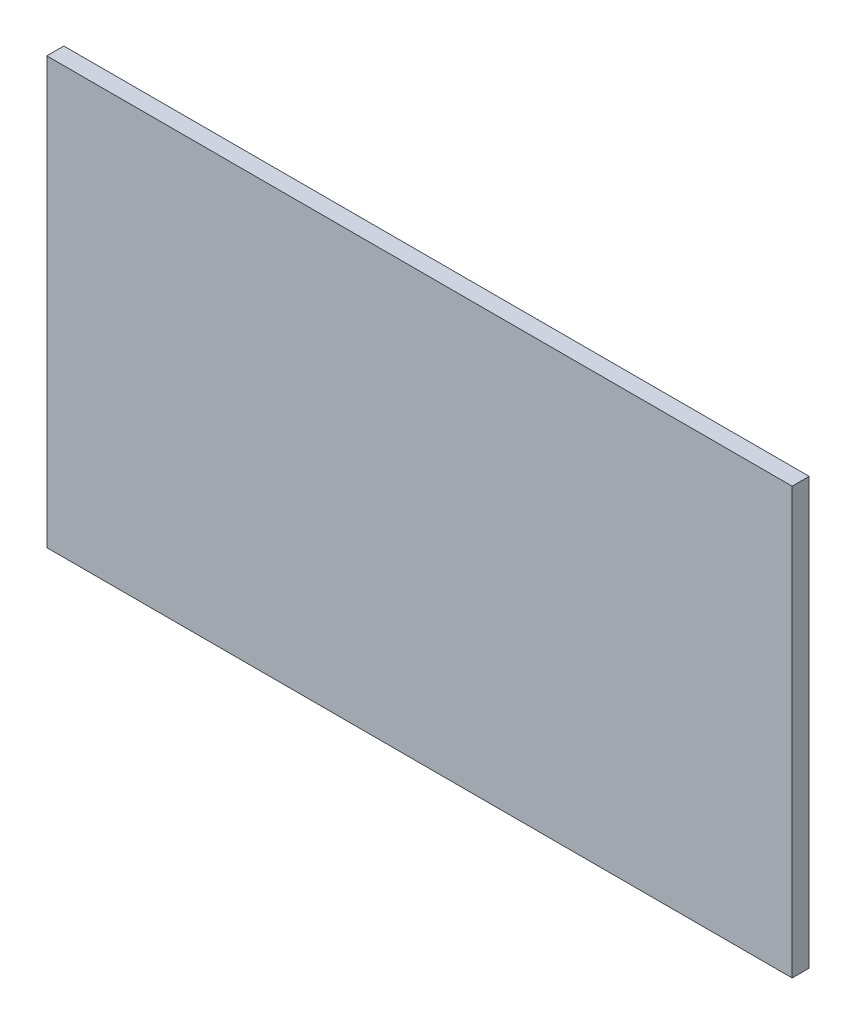
ISO-10303-21;
HEADER;
FILE_DESCRIPTION(('STEP AP214'),'2;1');
FILE_NAME('part.step','',(''),(''),'','','');
FILE_SCHEMA(('AUTOMOTIVE_DESIGN { 1 0 10303 214 1 1 1 1 }'));
ENDSEC;
DATA;
#1=APPLICATION_CONTEXT('core data for automotive mechanical design processes');
#2=APPLICATION_PROTOCOL_DEFINITION('international standard','automotive_design',2000,#1);
#3=PRODUCT_CONTEXT('',#1,'mechanical');
#4=PRODUCT('Part','Part','',(#3));
#5=PRODUCT_RELATED_PRODUCT_CATEGORY('part','',(#4));
#6=PRODUCT_DEFINITION_FORMATION('','',#4);
#7=PRODUCT_DEFINITION_CONTEXT('part definition',#1,'design');
#8=PRODUCT_DEFINITION('design','',#6,#7);
#9=PRODUCT_DEFINITION_SHAPE('','',#8);
#10=(LENGTH_UNIT() NAMED_UNIT(*) SI_UNIT(.MILLI.,.METRE.));
#11=(NAMED_UNIT(*) PLANE_ANGLE_UNIT() SI_UNIT($,.RADIAN.));
#12=(NAMED_UNIT(*) SI_UNIT($,.STERADIAN.) SOLID_ANGLE_UNIT());
#13=UNCERTAINTY_MEASURE_WITH_UNIT(LENGTH_MEASURE(1.E-05),#10,'distance_accuracy_value','');
#14=(GEOMETRIC_REPRESENTATION_CONTEXT(3) GLOBAL_UNCERTAINTY_ASSIGNED_CONTEXT((#13)) GLOBAL_UNIT_ASSIGNED_CONTEXT((#10,
#11,#12)) REPRESENTATION_CONTEXT('',''));
#15=CARTESIAN_POINT('',(0.,0.,0.));
#16=DIRECTION('',(0.,0.,1.));
#17=DIRECTION('',(1.,0.,0.));
#18=AXIS2_PLACEMENT_3D('',#15,#16,#17);
#19=CARTESIAN_POINT('',(-35.,38.,1.6));
#20=DIRECTION('',(1.,0.,0.));
#21=DIRECTION('',(0.,0.,-1.));
#22=AXIS2_PLACEMENT_3D('',#19,#20,#21);
#23=PLANE('',#22);
#24=DIRECTION('',(0.,-1.,0.));
#25=VECTOR('',#24,1.);
#26=CARTESIAN_POINT('',(-35.,38.,0.));
#27=LINE('',#26,#25);
#28=CARTESIAN_POINT('',(-35.,78.,0.));
#29=VERTEX_POINT('',#28);
#30=CARTESIAN_POINT('',(-35.,38.,0.));
#31=VERTEX_POINT('',#30);
#32=EDGE_CURVE('E104',#29,#31,#27,.T.);
#33=ORIENTED_EDGE('',*,*,#32,.T.);
#34=DIRECTION('',(0.,0.,-1.));
#35=VECTOR('',#34,1.);
#36=CARTESIAN_POINT('',(-35.,38.,1.6));
#37=LINE('',#36,#35);
#38=CARTESIAN_POINT('',(-35.,38.,1.6));
#39=VERTEX_POINT('',#38);
#40=EDGE_CURVE('E11',#39,#31,#37,.T.);
#41=ORIENTED_EDGE('',*,*,#40,.F.);
#42=DIRECTION('',(0.,-1.,0.));
#43=VECTOR('',#42,1.);
#44=CARTESIAN_POINT('',(-35.,38.,1.6));
#45=LINE('',#44,#43);
#46=CARTESIAN_POINT('',(-35.,78.,1.6));
#47=VERTEX_POINT('',#46);
#48=EDGE_CURVE('E95',#47,#39,#45,.T.);
#49=ORIENTED_EDGE('',*,*,#48,.F.);
#50=DIRECTION('',(0.,0.,-1.));
#51=VECTOR('',#50,1.);
#52=CARTESIAN_POINT('',(-35.,78.,1.6));
#53=LINE('',#52,#51);
#54=EDGE_CURVE('E99',#47,#29,#53,.T.);
#55=ORIENTED_EDGE('',*,*,#54,.T.);
#56=EDGE_LOOP('',(#33,#41,#49,#55));
#57=FACE_BOUND('',#56,.T.);
#58=ADVANCED_FACE('F41',(#57),#23,.F.);
#59=CARTESIAN_POINT('',(-35.,38.,1.6));
#60=DIRECTION('',(0.,1.,0.));
#61=DIRECTION('',(0.,0.,1.));
#62=AXIS2_PLACEMENT_3D('',#59,#60,#61);
#63=PLANE('',#62);
#64=DIRECTION('',(1.,0.,0.));
#65=VECTOR('',#64,1.);
#66=CARTESIAN_POINT('',(-35.,38.,0.));
#67=LINE('',#66,#65);
#68=CARTESIAN_POINT('',(35.,38.,0.));
#69=VERTEX_POINT('',#68);
#70=EDGE_CURVE('E98',#31,#69,#67,.T.);
#71=ORIENTED_EDGE('',*,*,#70,.T.);
#72=DIRECTION('',(0.,0.,-1.));
#73=VECTOR('',#72,1.);
#74=CARTESIAN_POINT('',(35.,38.,1.6));
#75=LINE('',#74,#73);
#76=CARTESIAN_POINT('',(35.,38.,1.6));
#77=VERTEX_POINT('',#76);
#78=EDGE_CURVE('E47',#77,#69,#75,.T.);
#79=ORIENTED_EDGE('',*,*,#78,.F.);
#80=DIRECTION('',(1.,0.,0.));
#81=VECTOR('',#80,1.);
#82=CARTESIAN_POINT('',(-35.,38.,1.6));
#83=LINE('',#82,#81);
#84=EDGE_CURVE('E90',#39,#77,#83,.T.);
#85=ORIENTED_EDGE('',*,*,#84,.F.);
#86=ORIENTED_EDGE('',*,*,#40,.T.);
#87=EDGE_LOOP('',(#71,#79,#85,#86));
#88=FACE_BOUND('',#87,.T.);
#89=ADVANCED_FACE('F93',(#88),#63,.F.);
#90=CARTESIAN_POINT('',(35.,38.,1.6));
#91=DIRECTION('',(-1.,0.,0.));
#92=DIRECTION('',(0.,0.,1.));
#93=AXIS2_PLACEMENT_3D('',#90,#91,#92);
#94=PLANE('',#93);
#95=DIRECTION('',(0.,1.,0.));
#96=VECTOR('',#95,1.);
#97=CARTESIAN_POINT('',(35.,38.,0.));
#98=LINE('',#97,#96);
#99=CARTESIAN_POINT('',(35.,78.,0.));
#100=VERTEX_POINT('',#99);
#101=EDGE_CURVE('E71',#69,#100,#98,.T.);
#102=ORIENTED_EDGE('',*,*,#101,.T.);
#103=DIRECTION('',(0.,0.,-1.));
#104=VECTOR('',#103,1.);
#105=CARTESIAN_POINT('',(35.,78.,1.6));
#106=LINE('',#105,#104);
#107=CARTESIAN_POINT('',(35.,78.,1.6));
#108=VERTEX_POINT('',#107);
#109=EDGE_CURVE('E97',#108,#100,#106,.T.);
#110=ORIENTED_EDGE('',*,*,#109,.F.);
#111=DIRECTION('',(0.,1.,0.));
#112=VECTOR('',#111,1.);
#113=CARTESIAN_POINT('',(35.,38.,1.6));
#114=LINE('',#113,#112);
#115=EDGE_CURVE('E89',#77,#108,#114,.T.);
#116=ORIENTED_EDGE('',*,*,#115,.F.);
#117=ORIENTED_EDGE('',*,*,#78,.T.);
#118=EDGE_LOOP('',(#102,#110,#116,#117));
#119=FACE_BOUND('',#118,.T.);
#120=ADVANCED_FACE('F96',(#119),#94,.F.);
#121=CARTESIAN_POINT('',(-35.,78.,1.6));
#122=DIRECTION('',(0.,-1.,0.));
#123=DIRECTION('',(0.,0.,-1.));
#124=AXIS2_PLACEMENT_3D('',#121,#122,#123);
#125=PLANE('',#124);
#126=DIRECTION('',(-1.,0.,0.));
#127=VECTOR('',#126,1.);
#128=CARTESIAN_POINT('',(-35.,78.,0.));
#129=LINE('',#128,#127);
#130=EDGE_CURVE('E78',#100,#29,#129,.T.);
#131=ORIENTED_EDGE('',*,*,#130,.T.);
#132=ORIENTED_EDGE('',*,*,#54,.F.);
#133=DIRECTION('',(-1.,0.,0.));
#134=VECTOR('',#133,1.);
#135=CARTESIAN_POINT('',(-35.,78.,1.6));
#136=LINE('',#135,#134);
#137=EDGE_CURVE('E60',#108,#47,#136,.T.);
#138=ORIENTED_EDGE('',*,*,#137,.F.);
#139=ORIENTED_EDGE('',*,*,#109,.T.);
#140=EDGE_LOOP('',(#131,#132,#138,#139));
#141=FACE_BOUND('',#140,.T.);
#142=ADVANCED_FACE('F111',(#141),#125,.F.);
#143=CARTESIAN_POINT('',(0.,0.,1.6));
#144=DIRECTION('',(0.,0.,-1.));
#145=DIRECTION('',(-1.,0.,0.));
#146=AXIS2_PLACEMENT_3D('',#143,#144,#145);
#147=PLANE('',#146);
#148=ORIENTED_EDGE('',*,*,#48,.T.);
#149=ORIENTED_EDGE('',*,*,#84,.T.);
#150=ORIENTED_EDGE('',*,*,#115,.T.);
#151=ORIENTED_EDGE('',*,*,#137,.T.);
#152=EDGE_LOOP('',(#148,#149,#150,#151));
#153=FACE_BOUND('',#152,.T.);
#154=ADVANCED_FACE('F86',(#153),#147,.F.);
#155=CARTESIAN_POINT('',(0.,0.,0.));
#156=DIRECTION('',(0.,0.,-1.));
#157=DIRECTION('',(-1.,0.,0.));
#158=AXIS2_PLACEMENT_3D('',#155,#156,#157);
#159=PLANE('',#158);
#160=ORIENTED_EDGE('',*,*,#32,.F.);
#161=ORIENTED_EDGE('',*,*,#130,.F.);
#162=ORIENTED_EDGE('',*,*,#101,.F.);
#163=ORIENTED_EDGE('',*,*,#70,.F.);
#164=EDGE_LOOP('',(#160,#161,#162,#163));
#165=FACE_BOUND('',#164,.T.);
#166=ADVANCED_FACE('F112',(#165),#159,.T.);
#167=CLOSED_SHELL('',(#58,#89,#120,#142,#154,#166));
#168=MANIFOLD_SOLID_BREP('B2',#167);
#169=ADVANCED_BREP_SHAPE_REPRESENTATION('',(#18,#168),#14);
#170=SHAPE_DEFINITION_REPRESENTATION(#9,#169);
ENDSEC;
END-ISO-10303-21;
